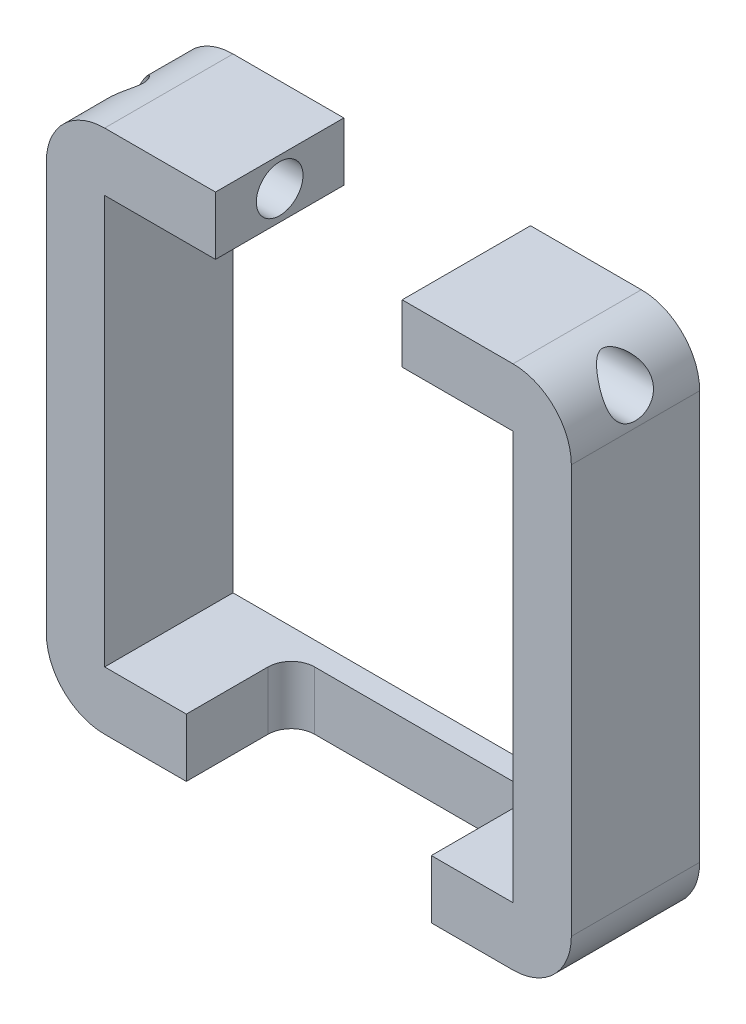
ISO-10303-21;
HEADER;
FILE_DESCRIPTION(('STEP AP214'),'2;1');
FILE_NAME('part.step','',(''),(''),'','','');
FILE_SCHEMA(('AUTOMOTIVE_DESIGN { 1 0 10303 214 1 1 1 1 }'));
ENDSEC;
DATA;
#1=APPLICATION_CONTEXT('core data for automotive mechanical design processes');
#2=APPLICATION_PROTOCOL_DEFINITION('international standard','automotive_design',2000,#1);
#3=PRODUCT_CONTEXT('',#1,'mechanical');
#4=PRODUCT('Part','Part','',(#3));
#5=PRODUCT_RELATED_PRODUCT_CATEGORY('part','',(#4));
#6=PRODUCT_DEFINITION_FORMATION('','',#4);
#7=PRODUCT_DEFINITION_CONTEXT('part definition',#1,'design');
#8=PRODUCT_DEFINITION('design','',#6,#7);
#9=PRODUCT_DEFINITION_SHAPE('','',#8);
#10=(LENGTH_UNIT() NAMED_UNIT(*) SI_UNIT(.MILLI.,.METRE.));
#11=(NAMED_UNIT(*) PLANE_ANGLE_UNIT() SI_UNIT($,.RADIAN.));
#12=(NAMED_UNIT(*) SI_UNIT($,.STERADIAN.) SOLID_ANGLE_UNIT());
#13=UNCERTAINTY_MEASURE_WITH_UNIT(LENGTH_MEASURE(1.E-05),#10,'distance_accuracy_value','');
#14=(GEOMETRIC_REPRESENTATION_CONTEXT(3) GLOBAL_UNCERTAINTY_ASSIGNED_CONTEXT((#13)) GLOBAL_UNIT_ASSIGNED_CONTEXT((#10,
#11,#12)) REPRESENTATION_CONTEXT('',''));
#15=CARTESIAN_POINT('',(0.,0.,0.));
#16=DIRECTION('',(0.,0.,1.));
#17=DIRECTION('',(1.,0.,0.));
#18=AXIS2_PLACEMENT_3D('',#15,#16,#17);
#19=CARTESIAN_POINT('',(-17.5,-17.5,11.));
#20=DIRECTION('',(0.,0.,-1.));
#21=DIRECTION('',(-1.,0.,0.));
#22=AXIS2_PLACEMENT_3D('',#19,#20,#21);
#23=PLANE('',#22);
#24=DIRECTION('',(0.,-1.,0.));
#25=VECTOR('',#24,1.);
#26=CARTESIAN_POINT('',(10.5,40.3473193175917,11.));
#27=LINE('',#26,#25);
#28=CARTESIAN_POINT('',(10.5,-17.5,11.));
#29=VERTEX_POINT('',#28);
#30=CARTESIAN_POINT('',(10.5,-22.5,11.));
#31=VERTEX_POINT('',#30);
#32=EDGE_CURVE('E454',#29,#31,#27,.T.);
#33=ORIENTED_EDGE('',*,*,#32,.T.);
#34=DIRECTION('',(1.,0.,0.));
#35=VECTOR('',#34,1.);
#36=CARTESIAN_POINT('',(17.5,-22.5,11.));
#37=LINE('',#36,#35);
#38=CARTESIAN_POINT('',(17.5,-22.5,11.));
#39=VERTEX_POINT('',#38);
#40=EDGE_CURVE('E256',#31,#39,#37,.T.);
#41=ORIENTED_EDGE('',*,*,#40,.T.);
#42=CARTESIAN_POINT('',(17.5,-17.5,11.));
#43=DIRECTION('',(0.,0.,1.));
#44=DIRECTION('',(1.,0.,0.));
#45=AXIS2_PLACEMENT_3D('',#42,#43,#44);
#46=CIRCLE('',#45,5.);
#47=CARTESIAN_POINT('',(22.5,-17.5,11.));
#48=VERTEX_POINT('',#47);
#49=EDGE_CURVE('E262',#39,#48,#46,.T.);
#50=ORIENTED_EDGE('',*,*,#49,.T.);
#51=DIRECTION('',(0.,1.,0.));
#52=VECTOR('',#51,1.);
#53=CARTESIAN_POINT('',(22.5,-17.5,11.));
#54=LINE('',#53,#52);
#55=CARTESIAN_POINT('',(22.5,17.5,11.));
#56=VERTEX_POINT('',#55);
#57=EDGE_CURVE('E265',#48,#56,#54,.T.);
#58=ORIENTED_EDGE('',*,*,#57,.T.);
#59=CARTESIAN_POINT('',(17.5,17.5,11.));
#60=DIRECTION('',(0.,0.,1.));
#61=DIRECTION('',(1.,0.,0.));
#62=AXIS2_PLACEMENT_3D('',#59,#60,#61);
#63=CIRCLE('',#62,5.);
#64=CARTESIAN_POINT('',(17.5,22.5,11.));
#65=VERTEX_POINT('',#64);
#66=EDGE_CURVE('E268',#56,#65,#63,.T.);
#67=ORIENTED_EDGE('',*,*,#66,.T.);
#68=DIRECTION('',(-1.,0.,0.));
#69=VECTOR('',#68,1.);
#70=CARTESIAN_POINT('',(17.5,22.5,11.));
#71=LINE('',#70,#69);
#72=CARTESIAN_POINT('',(8.,22.5,11.));
#73=VERTEX_POINT('',#72);
#74=EDGE_CURVE('E272',#65,#73,#71,.T.);
#75=ORIENTED_EDGE('',*,*,#74,.T.);
#76=DIRECTION('',(0.,1.,0.));
#77=VECTOR('',#76,1.);
#78=CARTESIAN_POINT('',(8.,25.5,11.));
#79=LINE('',#78,#77);
#80=CARTESIAN_POINT('',(8.,17.5,11.));
#81=VERTEX_POINT('',#80);
#82=EDGE_CURVE('E487',#81,#73,#79,.T.);
#83=ORIENTED_EDGE('',*,*,#82,.F.);
#84=DIRECTION('',(-1.,0.,0.));
#85=VECTOR('',#84,1.);
#86=CARTESIAN_POINT('',(17.5,17.5,11.));
#87=LINE('',#86,#85);
#88=CARTESIAN_POINT('',(17.5,17.5,11.));
#89=VERTEX_POINT('',#88);
#90=EDGE_CURVE('E213',#89,#81,#87,.T.);
#91=ORIENTED_EDGE('',*,*,#90,.F.);
#92=DIRECTION('',(0.,1.,0.));
#93=VECTOR('',#92,1.);
#94=CARTESIAN_POINT('',(17.5,-17.5,11.));
#95=LINE('',#94,#93);
#96=CARTESIAN_POINT('',(17.5,-17.5,11.));
#97=VERTEX_POINT('',#96);
#98=EDGE_CURVE('E235',#97,#89,#95,.T.);
#99=ORIENTED_EDGE('',*,*,#98,.F.);
#100=DIRECTION('',(1.,0.,0.));
#101=VECTOR('',#100,1.);
#102=CARTESIAN_POINT('',(17.5,-17.5,11.));
#103=LINE('',#102,#101);
#104=EDGE_CURVE('E458',#29,#97,#103,.T.);
#105=ORIENTED_EDGE('',*,*,#104,.F.);
#106=EDGE_LOOP('',(#33,#41,#50,#58,#67,#75,#83,#91,#99,#105));
#107=FACE_BOUND('',#106,.T.);
#108=ADVANCED_FACE('F38',(#107),#23,.F.);
#109=CARTESIAN_POINT('',(17.5,-22.5,11.));
#110=DIRECTION('',(0.,1.,0.));
#111=DIRECTION('',(-1.,0.,0.));
#112=AXIS2_PLACEMENT_3D('',#109,#110,#111);
#113=PLANE('',#112);
#114=DIRECTION('',(0.,0.,1.));
#115=VECTOR('',#114,1.);
#116=CARTESIAN_POINT('',(10.5,-22.5,11.));
#117=LINE('',#116,#115);
#118=CARTESIAN_POINT('',(10.5,-22.5,4.));
#119=VERTEX_POINT('',#118);
#120=EDGE_CURVE('E345',#119,#31,#117,.T.);
#121=ORIENTED_EDGE('',*,*,#120,.F.);
#122=CARTESIAN_POINT('',(8.50000000000001,-22.5,4.));
#123=DIRECTION('',(0.,-1.,0.));
#124=DIRECTION('',(1.,0.,0.));
#125=AXIS2_PLACEMENT_3D('',#122,#123,#124);
#126=CIRCLE('',#125,2.);
#127=CARTESIAN_POINT('',(8.50000000000001,-22.5,2.));
#128=VERTEX_POINT('',#127);
#129=EDGE_CURVE('E42',#119,#128,#126,.F.);
#130=ORIENTED_EDGE('',*,*,#129,.T.);
#131=DIRECTION('',(-1.,0.,0.));
#132=VECTOR('',#131,1.);
#133=CARTESIAN_POINT('',(0.,-22.5,2.));
#134=LINE('',#133,#132);
#135=CARTESIAN_POINT('',(-8.49999999999999,-22.5,2.));
#136=VERTEX_POINT('',#135);
#137=EDGE_CURVE('E359',#136,#128,#134,.F.);
#138=ORIENTED_EDGE('',*,*,#137,.F.);
#139=CARTESIAN_POINT('',(-8.49999999999999,-22.5,4.));
#140=DIRECTION('',(0.,-1.,0.));
#141=DIRECTION('',(1.,0.,0.));
#142=AXIS2_PLACEMENT_3D('',#139,#140,#141);
#143=CIRCLE('',#142,2.);
#144=CARTESIAN_POINT('',(-10.5,-22.5,4.));
#145=VERTEX_POINT('',#144);
#146=EDGE_CURVE('E357',#145,#136,#143,.T.);
#147=ORIENTED_EDGE('',*,*,#146,.F.);
#148=DIRECTION('',(0.,0.,1.));
#149=VECTOR('',#148,1.);
#150=CARTESIAN_POINT('',(-10.5,-22.5,11.));
#151=LINE('',#150,#149);
#152=CARTESIAN_POINT('',(-10.5,-22.5,11.));
#153=VERTEX_POINT('',#152);
#154=EDGE_CURVE('E360',#145,#153,#151,.T.);
#155=ORIENTED_EDGE('',*,*,#154,.T.);
#156=CARTESIAN_POINT('',(-17.5,-22.5,11.));
#157=VERTEX_POINT('',#156);
#158=EDGE_CURVE('E258',#157,#153,#37,.T.);
#159=ORIENTED_EDGE('',*,*,#158,.F.);
#160=DIRECTION('',(0.,0.,-1.));
#161=VECTOR('',#160,1.);
#162=CARTESIAN_POINT('',(-17.5,-22.5,11.));
#163=LINE('',#162,#161);
#164=CARTESIAN_POINT('',(-17.5,-22.5,0.));
#165=VERTEX_POINT('',#164);
#166=EDGE_CURVE('E334',#157,#165,#163,.T.);
#167=ORIENTED_EDGE('',*,*,#166,.T.);
#168=DIRECTION('',(1.,0.,0.));
#169=VECTOR('',#168,1.);
#170=CARTESIAN_POINT('',(17.5,-22.5,0.));
#171=LINE('',#170,#169);
#172=CARTESIAN_POINT('',(17.5,-22.5,0.));
#173=VERTEX_POINT('',#172);
#174=EDGE_CURVE('E286',#165,#173,#171,.T.);
#175=ORIENTED_EDGE('',*,*,#174,.T.);
#176=DIRECTION('',(0.,0.,-1.));
#177=VECTOR('',#176,1.);
#178=CARTESIAN_POINT('',(17.5,-22.5,11.));
#179=LINE('',#178,#177);
#180=EDGE_CURVE('E330',#39,#173,#179,.T.);
#181=ORIENTED_EDGE('',*,*,#180,.F.);
#182=ORIENTED_EDGE('',*,*,#40,.F.);
#183=EDGE_LOOP('',(#121,#130,#138,#147,#155,#159,#167,#175,#181,#182));
#184=FACE_BOUND('',#183,.T.);
#185=ADVANCED_FACE('F421',(#184),#113,.F.);
#186=CARTESIAN_POINT('',(17.5,-17.5,11.));
#187=DIRECTION('',(0.,1.,0.));
#188=DIRECTION('',(-1.,0.,0.));
#189=AXIS2_PLACEMENT_3D('',#186,#187,#188);
#190=PLANE('',#189);
#191=CARTESIAN_POINT('',(8.50000000000001,-17.5,4.));
#192=DIRECTION('',(0.,1.,0.));
#193=DIRECTION('',(-1.,0.,0.));
#194=AXIS2_PLACEMENT_3D('',#191,#192,#193);
#195=CIRCLE('',#194,2.);
#196=CARTESIAN_POINT('',(8.50000000000001,-17.5,2.));
#197=VERTEX_POINT('',#196);
#198=CARTESIAN_POINT('',(10.5,-17.5,4.));
#199=VERTEX_POINT('',#198);
#200=EDGE_CURVE('E49',#197,#199,#195,.F.);
#201=ORIENTED_EDGE('',*,*,#200,.T.);
#202=DIRECTION('',(0.,0.,1.));
#203=VECTOR('',#202,1.);
#204=CARTESIAN_POINT('',(10.5,-17.5,11.));
#205=LINE('',#204,#203);
#206=EDGE_CURVE('E11',#199,#29,#205,.T.);
#207=ORIENTED_EDGE('',*,*,#206,.T.);
#208=ORIENTED_EDGE('',*,*,#104,.T.);
#209=DIRECTION('',(0.,0.,-1.));
#210=VECTOR('',#209,1.);
#211=CARTESIAN_POINT('',(17.5,-17.5,11.));
#212=LINE('',#211,#210);
#213=CARTESIAN_POINT('',(17.5,-17.5,0.));
#214=VERTEX_POINT('',#213);
#215=EDGE_CURVE('E236',#97,#214,#212,.T.);
#216=ORIENTED_EDGE('',*,*,#215,.T.);
#217=DIRECTION('',(1.,0.,0.));
#218=VECTOR('',#217,1.);
#219=CARTESIAN_POINT('',(17.5,-17.5,0.));
#220=LINE('',#219,#218);
#221=CARTESIAN_POINT('',(-17.5,-17.5,0.));
#222=VERTEX_POINT('',#221);
#223=EDGE_CURVE('E228',#222,#214,#220,.T.);
#224=ORIENTED_EDGE('',*,*,#223,.F.);
#225=DIRECTION('',(0.,0.,-1.));
#226=VECTOR('',#225,1.);
#227=CARTESIAN_POINT('',(-17.5,-17.5,11.));
#228=LINE('',#227,#226);
#229=CARTESIAN_POINT('',(-17.5,-17.5,11.));
#230=VERTEX_POINT('',#229);
#231=EDGE_CURVE('E240',#230,#222,#228,.T.);
#232=ORIENTED_EDGE('',*,*,#231,.F.);
#233=CARTESIAN_POINT('',(-10.5,-17.5,11.));
#234=VERTEX_POINT('',#233);
#235=EDGE_CURVE('E241',#230,#234,#103,.T.);
#236=ORIENTED_EDGE('',*,*,#235,.T.);
#237=DIRECTION('',(0.,0.,1.));
#238=VECTOR('',#237,1.);
#239=CARTESIAN_POINT('',(-10.5,-17.5,11.));
#240=LINE('',#239,#238);
#241=CARTESIAN_POINT('',(-10.5,-17.5,4.));
#242=VERTEX_POINT('',#241);
#243=EDGE_CURVE('E84',#242,#234,#240,.T.);
#244=ORIENTED_EDGE('',*,*,#243,.F.);
#245=CARTESIAN_POINT('',(-8.49999999999999,-17.5,4.));
#246=DIRECTION('',(0.,1.,0.));
#247=DIRECTION('',(-1.,0.,0.));
#248=AXIS2_PLACEMENT_3D('',#245,#246,#247);
#249=CIRCLE('',#248,2.);
#250=CARTESIAN_POINT('',(-8.49999999999999,-17.5,2.));
#251=VERTEX_POINT('',#250);
#252=EDGE_CURVE('E348',#251,#242,#249,.T.);
#253=ORIENTED_EDGE('',*,*,#252,.F.);
#254=DIRECTION('',(-1.,0.,0.));
#255=VECTOR('',#254,1.);
#256=CARTESIAN_POINT('',(17.5,-17.5,2.));
#257=LINE('',#256,#255);
#258=EDGE_CURVE('E351',#197,#251,#257,.T.);
#259=ORIENTED_EDGE('',*,*,#258,.F.);
#260=EDGE_LOOP('',(#201,#207,#208,#216,#224,#232,#236,#244,#253,#259));
#261=FACE_BOUND('',#260,.T.);
#262=ADVANCED_FACE('F417',(#261),#190,.T.);
#263=CARTESIAN_POINT('',(17.5,22.5,11.));
#264=DIRECTION('',(0.,-1.,0.));
#265=DIRECTION('',(1.,0.,0.));
#266=AXIS2_PLACEMENT_3D('',#263,#264,#265);
#267=PLANE('',#266);
#268=DIRECTION('',(-1.,0.,0.));
#269=VECTOR('',#268,1.);
#270=CARTESIAN_POINT('',(17.5,22.5,0.));
#271=LINE('',#270,#269);
#272=CARTESIAN_POINT('',(17.5,22.5,0.));
#273=VERTEX_POINT('',#272);
#274=CARTESIAN_POINT('',(8.,22.5,0.));
#275=VERTEX_POINT('',#274);
#276=EDGE_CURVE('E299',#273,#275,#271,.T.);
#277=ORIENTED_EDGE('',*,*,#276,.T.);
#278=DIRECTION('',(0.,0.,1.));
#279=VECTOR('',#278,1.);
#280=CARTESIAN_POINT('',(8.,22.5,11.));
#281=LINE('',#280,#279);
#282=EDGE_CURVE('E198',#275,#73,#281,.T.);
#283=ORIENTED_EDGE('',*,*,#282,.T.);
#284=ORIENTED_EDGE('',*,*,#74,.F.);
#285=DIRECTION('',(0.,0.,-1.));
#286=VECTOR('',#285,1.);
#287=CARTESIAN_POINT('',(17.5,22.5,11.));
#288=LINE('',#287,#286);
#289=EDGE_CURVE('E318',#65,#273,#288,.T.);
#290=ORIENTED_EDGE('',*,*,#289,.T.);
#291=EDGE_LOOP('',(#277,#283,#284,#290));
#292=FACE_BOUND('',#291,.T.);
#293=ADVANCED_FACE('F420',(#292),#267,.F.);
#294=CARTESIAN_POINT('',(17.5,17.5,11.));
#295=DIRECTION('',(0.,-1.,0.));
#296=DIRECTION('',(1.,0.,0.));
#297=AXIS2_PLACEMENT_3D('',#294,#295,#296);
#298=PLANE('',#297);
#299=ORIENTED_EDGE('',*,*,#90,.T.);
#300=DIRECTION('',(0.,0.,1.));
#301=VECTOR('',#300,1.);
#302=CARTESIAN_POINT('',(8.,17.5,11.));
#303=LINE('',#302,#301);
#304=CARTESIAN_POINT('',(8.,17.5,0.));
#305=VERTEX_POINT('',#304);
#306=EDGE_CURVE('E195',#305,#81,#303,.T.);
#307=ORIENTED_EDGE('',*,*,#306,.F.);
#308=DIRECTION('',(-1.,0.,0.));
#309=VECTOR('',#308,1.);
#310=CARTESIAN_POINT('',(17.5,17.5,0.));
#311=LINE('',#310,#309);
#312=CARTESIAN_POINT('',(17.5,17.5,0.));
#313=VERTEX_POINT('',#312);
#314=EDGE_CURVE('E210',#313,#305,#311,.T.);
#315=ORIENTED_EDGE('',*,*,#314,.F.);
#316=DIRECTION('',(0.,0.,-1.));
#317=VECTOR('',#316,1.);
#318=CARTESIAN_POINT('',(17.5,17.5,11.));
#319=LINE('',#318,#317);
#320=EDGE_CURVE('E248',#89,#313,#319,.T.);
#321=ORIENTED_EDGE('',*,*,#320,.F.);
#322=EDGE_LOOP('',(#299,#307,#315,#321));
#323=FACE_BOUND('',#322,.T.);
#324=ADVANCED_FACE('F208',(#323),#298,.T.);
#325=ORIENTED_EDGE('',*,*,#158,.T.);
#326=DIRECTION('',(0.,-1.,0.));
#327=VECTOR('',#326,1.);
#328=CARTESIAN_POINT('',(-10.5,40.3473193175917,11.));
#329=LINE('',#328,#327);
#330=EDGE_CURVE('E534',#234,#153,#329,.T.);
#331=ORIENTED_EDGE('',*,*,#330,.F.);
#332=ORIENTED_EDGE('',*,*,#235,.F.);
#333=DIRECTION('',(0.,-1.,0.));
#334=VECTOR('',#333,1.);
#335=CARTESIAN_POINT('',(-17.5,-17.5,11.));
#336=LINE('',#335,#334);
#337=CARTESIAN_POINT('',(-17.5,17.5,11.));
#338=VERTEX_POINT('',#337);
#339=EDGE_CURVE('E468',#338,#230,#336,.T.);
#340=ORIENTED_EDGE('',*,*,#339,.F.);
#341=CARTESIAN_POINT('',(-8.,17.5,11.));
#342=VERTEX_POINT('',#341);
#343=EDGE_CURVE('E473',#342,#338,#87,.T.);
#344=ORIENTED_EDGE('',*,*,#343,.F.);
#345=DIRECTION('',(0.,-1.,0.));
#346=VECTOR('',#345,1.);
#347=CARTESIAN_POINT('',(-8.,25.5,11.));
#348=LINE('',#347,#346);
#349=CARTESIAN_POINT('',(-8.,22.5,11.));
#350=VERTEX_POINT('',#349);
#351=EDGE_CURVE('E205',#350,#342,#348,.T.);
#352=ORIENTED_EDGE('',*,*,#351,.F.);
#353=CARTESIAN_POINT('',(-17.5,22.5,11.));
#354=VERTEX_POINT('',#353);
#355=EDGE_CURVE('E271',#350,#354,#71,.T.);
#356=ORIENTED_EDGE('',*,*,#355,.T.);
#357=CARTESIAN_POINT('',(-17.5,17.5,11.));
#358=DIRECTION('',(0.,0.,1.));
#359=DIRECTION('',(1.,0.,0.));
#360=AXIS2_PLACEMENT_3D('',#357,#358,#359);
#361=CIRCLE('',#360,5.);
#362=CARTESIAN_POINT('',(-22.5,17.5,11.));
#363=VERTEX_POINT('',#362);
#364=EDGE_CURVE('E276',#354,#363,#361,.T.);
#365=ORIENTED_EDGE('',*,*,#364,.T.);
#366=DIRECTION('',(0.,-1.,0.));
#367=VECTOR('',#366,1.);
#368=CARTESIAN_POINT('',(-22.5,-17.5,11.));
#369=LINE('',#368,#367);
#370=CARTESIAN_POINT('',(-22.5,-17.5,11.));
#371=VERTEX_POINT('',#370);
#372=EDGE_CURVE('E279',#363,#371,#369,.T.);
#373=ORIENTED_EDGE('',*,*,#372,.T.);
#374=CARTESIAN_POINT('',(-17.5,-17.5,11.));
#375=DIRECTION('',(0.,0.,1.));
#376=DIRECTION('',(-1.,0.,0.));
#377=AXIS2_PLACEMENT_3D('',#374,#375,#376);
#378=CIRCLE('',#377,5.);
#379=EDGE_CURVE('E252',#371,#157,#378,.T.);
#380=ORIENTED_EDGE('',*,*,#379,.T.);
#381=EDGE_LOOP('',(#325,#331,#332,#340,#344,#352,#356,#365,#373,#380));
#382=FACE_BOUND('',#381,.T.);
#383=ADVANCED_FACE('F435',(#382),#23,.F.);
#384=CARTESIAN_POINT('',(-17.5,-17.5,0.));
#385=DIRECTION('',(0.,0.,-1.));
#386=DIRECTION('',(-1.,0.,0.));
#387=AXIS2_PLACEMENT_3D('',#384,#385,#386);
#388=PLANE('',#387);
#389=DIRECTION('',(0.,1.,0.));
#390=VECTOR('',#389,1.);
#391=CARTESIAN_POINT('',(8.,25.5,0.));
#392=LINE('',#391,#390);
#393=EDGE_CURVE('E192',#305,#275,#392,.T.);
#394=ORIENTED_EDGE('',*,*,#393,.T.);
#395=ORIENTED_EDGE('',*,*,#276,.F.);
#396=CARTESIAN_POINT('',(17.5,17.5,0.));
#397=DIRECTION('',(0.,0.,1.));
#398=DIRECTION('',(1.,0.,0.));
#399=AXIS2_PLACEMENT_3D('',#396,#397,#398);
#400=CIRCLE('',#399,5.);
#401=CARTESIAN_POINT('',(22.5,17.5,0.));
#402=VERTEX_POINT('',#401);
#403=EDGE_CURVE('E295',#402,#273,#400,.T.);
#404=ORIENTED_EDGE('',*,*,#403,.F.);
#405=DIRECTION('',(0.,1.,0.));
#406=VECTOR('',#405,1.);
#407=CARTESIAN_POINT('',(22.5,-17.5,0.));
#408=LINE('',#407,#406);
#409=CARTESIAN_POINT('',(22.5,-17.5,0.));
#410=VERTEX_POINT('',#409);
#411=EDGE_CURVE('E292',#410,#402,#408,.T.);
#412=ORIENTED_EDGE('',*,*,#411,.F.);
#413=CARTESIAN_POINT('',(17.5,-17.5,0.));
#414=DIRECTION('',(0.,0.,1.));
#415=DIRECTION('',(1.,0.,0.));
#416=AXIS2_PLACEMENT_3D('',#413,#414,#415);
#417=CIRCLE('',#416,5.);
#418=EDGE_CURVE('E289',#173,#410,#417,.T.);
#419=ORIENTED_EDGE('',*,*,#418,.F.);
#420=ORIENTED_EDGE('',*,*,#174,.F.);
#421=CARTESIAN_POINT('',(-17.5,-17.5,0.));
#422=DIRECTION('',(0.,0.,1.));
#423=DIRECTION('',(-1.,0.,0.));
#424=AXIS2_PLACEMENT_3D('',#421,#422,#423);
#425=CIRCLE('',#424,5.);
#426=CARTESIAN_POINT('',(-22.5,-17.5,0.));
#427=VERTEX_POINT('',#426);
#428=EDGE_CURVE('E251',#427,#165,#425,.T.);
#429=ORIENTED_EDGE('',*,*,#428,.F.);
#430=DIRECTION('',(0.,-1.,0.));
#431=VECTOR('',#430,1.);
#432=CARTESIAN_POINT('',(-22.5,-17.5,0.));
#433=LINE('',#432,#431);
#434=CARTESIAN_POINT('',(-22.5,17.5,0.));
#435=VERTEX_POINT('',#434);
#436=EDGE_CURVE('E257',#435,#427,#433,.T.);
#437=ORIENTED_EDGE('',*,*,#436,.F.);
#438=CARTESIAN_POINT('',(-17.5,17.5,0.));
#439=DIRECTION('',(0.,0.,1.));
#440=DIRECTION('',(1.,0.,0.));
#441=AXIS2_PLACEMENT_3D('',#438,#439,#440);
#442=CIRCLE('',#441,5.);
#443=CARTESIAN_POINT('',(-17.5,22.5,0.));
#444=VERTEX_POINT('',#443);
#445=EDGE_CURVE('E302',#444,#435,#442,.T.);
#446=ORIENTED_EDGE('',*,*,#445,.F.);
#447=CARTESIAN_POINT('',(-8.,22.5,0.));
#448=VERTEX_POINT('',#447);
#449=EDGE_CURVE('E298',#448,#444,#271,.T.);
#450=ORIENTED_EDGE('',*,*,#449,.F.);
#451=DIRECTION('',(0.,-1.,0.));
#452=VECTOR('',#451,1.);
#453=CARTESIAN_POINT('',(-8.,25.5,0.));
#454=LINE('',#453,#452);
#455=CARTESIAN_POINT('',(-8.,17.5,0.));
#456=VERTEX_POINT('',#455);
#457=EDGE_CURVE('E204',#448,#456,#454,.T.);
#458=ORIENTED_EDGE('',*,*,#457,.T.);
#459=CARTESIAN_POINT('',(-17.5,17.5,0.));
#460=VERTEX_POINT('',#459);
#461=EDGE_CURVE('E223',#456,#460,#311,.T.);
#462=ORIENTED_EDGE('',*,*,#461,.T.);
#463=DIRECTION('',(0.,-1.,0.));
#464=VECTOR('',#463,1.);
#465=CARTESIAN_POINT('',(-17.5,-17.5,0.));
#466=LINE('',#465,#464);
#467=EDGE_CURVE('E222',#460,#222,#466,.T.);
#468=ORIENTED_EDGE('',*,*,#467,.T.);
#469=ORIENTED_EDGE('',*,*,#223,.T.);
#470=DIRECTION('',(0.,1.,0.));
#471=VECTOR('',#470,1.);
#472=CARTESIAN_POINT('',(17.5,-17.5,0.));
#473=LINE('',#472,#471);
#474=EDGE_CURVE('E220',#214,#313,#473,.T.);
#475=ORIENTED_EDGE('',*,*,#474,.T.);
#476=ORIENTED_EDGE('',*,*,#314,.T.);
#477=EDGE_LOOP('',(#394,#395,#404,#412,#419,#420,#429,#437,#446,#450,#458,#462,#468,#469,#475,#476));
#478=FACE_BOUND('',#477,.T.);
#479=ADVANCED_FACE('F218',(#478),#388,.T.);
#480=CARTESIAN_POINT('',(-17.5,-17.5,11.));
#481=DIRECTION('',(0.,0.,-1.));
#482=DIRECTION('',(-1.,0.,0.));
#483=AXIS2_PLACEMENT_3D('',#480,#481,#482);
#484=CYLINDRICAL_SURFACE('',#483,5.);
#485=ORIENTED_EDGE('',*,*,#428,.T.);
#486=ORIENTED_EDGE('',*,*,#166,.F.);
#487=ORIENTED_EDGE('',*,*,#379,.F.);
#488=DIRECTION('',(0.,0.,-1.));
#489=VECTOR('',#488,1.);
#490=CARTESIAN_POINT('',(-22.5,-17.5,11.));
#491=LINE('',#490,#489);
#492=EDGE_CURVE('E282',#371,#427,#491,.T.);
#493=ORIENTED_EDGE('',*,*,#492,.T.);
#494=EDGE_LOOP('',(#485,#486,#487,#493));
#495=FACE_BOUND('',#494,.T.);
#496=ADVANCED_FACE('F40',(#495),#484,.T.);
#497=CARTESIAN_POINT('',(17.5,-17.5,11.));
#498=DIRECTION('',(0.,0.,-1.));
#499=DIRECTION('',(-1.,0.,0.));
#500=AXIS2_PLACEMENT_3D('',#497,#498,#499);
#501=CYLINDRICAL_SURFACE('',#500,5.);
#502=ORIENTED_EDGE('',*,*,#418,.T.);
#503=DIRECTION('',(0.,0.,-1.));
#504=VECTOR('',#503,1.);
#505=CARTESIAN_POINT('',(22.5,-17.5,11.));
#506=LINE('',#505,#504);
#507=EDGE_CURVE('E326',#48,#410,#506,.T.);
#508=ORIENTED_EDGE('',*,*,#507,.F.);
#509=ORIENTED_EDGE('',*,*,#49,.F.);
#510=ORIENTED_EDGE('',*,*,#180,.T.);
#511=EDGE_LOOP('',(#502,#508,#509,#510));
#512=FACE_BOUND('',#511,.T.);
#513=ADVANCED_FACE('F517',(#512),#501,.T.);
#514=CARTESIAN_POINT('',(22.5,-17.5,11.));
#515=DIRECTION('',(-1.,0.,0.));
#516=DIRECTION('',(0.,0.,1.));
#517=AXIS2_PLACEMENT_3D('',#514,#515,#516);
#518=PLANE('',#517);
#519=ORIENTED_EDGE('',*,*,#411,.T.);
#520=DIRECTION('',(0.,0.,-1.));
#521=VECTOR('',#520,1.);
#522=CARTESIAN_POINT('',(22.5,17.5,11.));
#523=LINE('',#522,#521);
#524=EDGE_CURVE('E322',#56,#402,#523,.T.);
#525=ORIENTED_EDGE('',*,*,#524,.F.);
#526=ORIENTED_EDGE('',*,*,#57,.F.);
#527=ORIENTED_EDGE('',*,*,#507,.T.);
#528=EDGE_LOOP('',(#519,#525,#526,#527));
#529=FACE_BOUND('',#528,.T.);
#530=ADVANCED_FACE('F514',(#529),#518,.F.);
#531=CARTESIAN_POINT('',(17.5,17.5,11.));
#532=DIRECTION('',(0.,0.,-1.));
#533=DIRECTION('',(-1.,0.,0.));
#534=AXIS2_PLACEMENT_3D('',#531,#532,#533);
#535=CYLINDRICAL_SURFACE('',#534,5.);
#536=CARTESIAN_POINT('',(19.6794494717703,22.,5.5));
#537=CARTESIAN_POINT('',(19.6794610871701,21.9999956682622,5.44387350314343));
#538=CARTESIAN_POINT('',(19.6844150857633,21.9976052421311,5.3876670854986));
#539=CARTESIAN_POINT('',(19.703410387151,21.9883275174123,5.27716105357668));
#540=CARTESIAN_POINT('',(19.7174774225732,21.9814274844861,5.2228672992719));
#541=CARTESIAN_POINT('',(19.758857089708,21.9607461476106,5.09918814779269));
#542=CARTESIAN_POINT('',(19.7890647844713,21.9454122845089,5.03105630793691));
#543=CARTESIAN_POINT('',(19.8578472870379,21.9093157288409,4.90073392641085));
#544=CARTESIAN_POINT('',(19.8964457573905,21.8885376484833,4.83856091845565));
#545=CARTESIAN_POINT('',(19.9755594938146,21.8443643412487,4.72426502238298));
#546=CARTESIAN_POINT('',(20.0156861228987,21.8213028323326,4.67173631416122));
#547=CARTESIAN_POINT('',(20.0987916426582,21.7718407837752,4.57061782630151));
#548=CARTESIAN_POINT('',(20.1417728785505,21.7454374821284,4.52203136008637));
#549=CARTESIAN_POINT('',(20.2296085749584,21.6895053926106,4.4282936774126));
#550=CARTESIAN_POINT('',(20.2744665939904,21.6599704877905,4.38314949166027));
#551=CARTESIAN_POINT('',(20.3652752249796,21.5979537199052,4.29608988757497));
#552=CARTESIAN_POINT('',(20.4112261157368,21.5654710987729,4.2541753049559));
#553=CARTESIAN_POINT('',(20.5226655839025,21.4837200999407,4.15682808001239));
#554=CARTESIAN_POINT('',(20.5884369257356,21.4330317056113,4.1029027157887));
#555=CARTESIAN_POINT('',(20.7200401680996,21.3260350404006,4.00097044067647));
#556=CARTESIAN_POINT('',(20.7858720824527,21.2697244287569,3.95296601366951));
#557=CARTESIAN_POINT('',(20.9166361229946,21.1516220653819,3.86315566336801));
#558=CARTESIAN_POINT('',(20.9815694818802,21.0898389137179,3.82134028087125));
#559=CARTESIAN_POINT('',(21.1098739518841,20.9607943930903,3.74428888265097));
#560=CARTESIAN_POINT('',(21.1732449935161,20.8935327810349,3.70905315911077));
#561=CARTESIAN_POINT('',(21.3297055004064,20.7176715290623,3.62958388183047));
#562=CARTESIAN_POINT('',(21.4213459075965,20.6055802303112,3.59002070786181));
#563=CARTESIAN_POINT('',(21.5965802317542,20.3704435840845,3.5308843394572));
#564=CARTESIAN_POINT('',(21.6801863967492,20.2474154790547,3.51128026549913));
#565=CARTESIAN_POINT('',(21.8227256004434,20.0157757317008,3.49732350273812));
#566=CARTESIAN_POINT('',(21.8834037392977,19.9084828574563,3.49910538392452));
#567=CARTESIAN_POINT('',(21.9959888320893,19.6911244728663,3.52098434840557));
#568=CARTESIAN_POINT('',(22.0478995516625,19.5810601763164,3.54107354481355));
#569=CARTESIAN_POINT('',(22.1421500583991,19.3613995422978,3.60125761666443));
#570=CARTESIAN_POINT('',(22.1844315501177,19.251809800584,3.64146986499998));
#571=CARTESIAN_POINT('',(22.2587087632043,19.0386462497835,3.74225311298602));
#572=CARTESIAN_POINT('',(22.2907082648158,18.9350702412083,3.80281661356793));
#573=CARTESIAN_POINT('',(22.3423354917758,18.7490625781852,3.93575586963214));
#574=CARTESIAN_POINT('',(22.3628988545083,18.6655519228036,4.00626896484892));
#575=CARTESIAN_POINT('',(22.3974620935554,18.510534972916,4.16079708237234));
#576=CARTESIAN_POINT('',(22.4114626838356,18.4390273731381,4.24481063462502));
#577=CARTESIAN_POINT('',(22.434040674918,18.3119908791552,4.4219248748285));
#578=CARTESIAN_POINT('',(22.4427311921811,18.2561435084575,4.51478343219729));
#579=CARTESIAN_POINT('',(22.4564738753053,18.1600976593587,4.70851382594113));
#580=CARTESIAN_POINT('',(22.4615258385263,18.1199000525889,4.80938610827306));
#581=CARTESIAN_POINT('',(22.4691310823275,18.055707830683,5.01842387096183));
#582=CARTESIAN_POINT('',(22.471633407765,18.032046501529,5.12669359665549));
#583=CARTESIAN_POINT('',(22.4746662323596,18.0029044548575,5.34568335407257));
#584=CARTESIAN_POINT('',(22.4751965690477,17.9974252353384,5.45640358693332));
#585=CARTESIAN_POINT('',(22.4744488548188,18.0048501580201,5.67850212807621));
#586=CARTESIAN_POINT('',(22.4731499137831,18.0179666726707,5.78987333705495));
#587=CARTESIAN_POINT('',(22.4682991322877,18.0625845184449,6.0088262526139));
#588=CARTESIAN_POINT('',(22.4647472065699,18.094086545315,6.11640781562252));
#589=CARTESIAN_POINT('',(22.4544605578853,18.1745021737181,6.32462301660822));
#590=CARTESIAN_POINT('',(22.4477278206003,18.2234049078362,6.42526094442365));
#591=CARTESIAN_POINT('',(22.4297687860654,18.3370632295024,6.61670393457601));
#592=CARTESIAN_POINT('',(22.4185430778429,18.4018167385859,6.7075102838485));
#593=CARTESIAN_POINT('',(22.3903311008057,18.5439450237596,6.8754398079596));
#594=CARTESIAN_POINT('',(22.3734267079842,18.6211327192152,6.95273496363904));
#595=CARTESIAN_POINT('',(22.3325576045208,18.7859128915829,7.09301412952065));
#596=CARTESIAN_POINT('',(22.3085946551913,18.8735027696019,7.15600170293876));
#597=CARTESIAN_POINT('',(22.2532642330155,19.0540999904482,7.26528068506956));
#598=CARTESIAN_POINT('',(22.2220374294027,19.1469818296547,7.31185156000499));
#599=CARTESIAN_POINT('',(22.1517301340278,19.3361893799151,7.38939558491485));
#600=CARTESIAN_POINT('',(22.1126488415162,19.4325154412768,7.42036714344058));
#601=CARTESIAN_POINT('',(22.0257097692534,19.6283233268988,7.46781818434744));
#602=CARTESIAN_POINT('',(21.9776263091685,19.7278141103564,7.48384121714327));
#603=CARTESIAN_POINT('',(21.8743601636508,19.9243182504917,7.50100358811658));
#604=CARTESIAN_POINT('',(21.81917486321,20.0213306787511,7.50213742793624));
#605=CARTESIAN_POINT('',(21.6956091506305,20.2225837891963,7.49043617758354));
#606=CARTESIAN_POINT('',(21.6264409097284,20.3262349557607,7.47585646389394));
#607=CARTESIAN_POINT('',(21.4822215681467,20.5260802189683,7.43228361434451));
#608=CARTESIAN_POINT('',(21.407166389842,20.6222690533926,7.40328041236248));
#609=CARTESIAN_POINT('',(21.2143781318608,20.8519514421749,7.3154656053545));
#610=CARTESIAN_POINT('',(21.0939257593817,20.9803131032096,7.24900480863655));
#611=CARTESIAN_POINT('',(20.9098516731842,21.1579063109286,7.13226620356138));
#612=CARTESIAN_POINT('',(20.8478098254164,21.2147036092391,7.09041883073679));
#613=CARTESIAN_POINT('',(20.7232372828736,21.3232894868493,7.00127828356791));
#614=CARTESIAN_POINT('',(20.6607067356712,21.3750795194864,6.95398669816593));
#615=CARTESIAN_POINT('',(20.545816061733,21.465789703292,6.86196517443614));
#616=CARTESIAN_POINT('',(20.4934117857071,21.5054497651041,6.81801336044393));
#617=CARTESIAN_POINT('',(20.3893922217056,21.5811203987927,6.72621238159748));
#618=CARTESIAN_POINT('',(20.3377767890549,21.6171316468565,6.67836394182969));
#619=CARTESIAN_POINT('',(20.236265454929,21.6852808402617,6.57864110605409));
#620=CARTESIAN_POINT('',(20.1863646909691,21.7174305197405,6.52677973678277));
#621=CARTESIAN_POINT('',(20.0892744922947,21.7777228764064,6.41844588934647));
#622=CARTESIAN_POINT('',(20.0420825345094,21.8058693196845,6.36197782475972));
#623=CARTESIAN_POINT('',(19.9566009553914,21.8551461997104,6.2495451203254));
#624=CARTESIAN_POINT('',(19.9178926918383,21.8766958604517,6.19408783665427));
#625=CARTESIAN_POINT('',(19.8461279533412,21.9155795731742,6.07817276787235));
#626=CARTESIAN_POINT('',(19.8130672138284,21.9329168102642,6.01771880750839));
#627=CARTESIAN_POINT('',(19.7615302187217,21.9593887327359,5.90430649155941));
#628=CARTESIAN_POINT('',(19.7414561524271,21.9694736479165,5.8523114023411));
#629=CARTESIAN_POINT('',(19.708982785266,21.9856139119574,5.7454197611802));
#630=CARTESIAN_POINT('',(19.6965591999848,21.9916820157608,5.69053299666233));
#631=CARTESIAN_POINT('',(19.6857273702052,21.9969551326303,5.61258022016376));
#632=CARTESIAN_POINT('',(19.6833815870709,21.9980938692664,5.59014917773607));
#633=CARTESIAN_POINT('',(19.6802401440762,21.9996172508021,5.54514975371859));
#634=CARTESIAN_POINT('',(19.6794447985524,22.0000017427859,5.52258134520928));
#635=CARTESIAN_POINT('',(19.6794494717703,22.,5.5));
#636=B_SPLINE_CURVE_WITH_KNOTS('',3,(#536,#537,#538,#539,#540,#541,#542,#543,#544,#545,#546,
#547,#548,#549,#550,#551,#552,#553,#554,#555,#556,#557,#558,#559,#560,#561,#562,#563,#564,#565,
#566,#567,#568,#569,#570,#571,#572,#573,#574,#575,#576,#577,#578,#579,#580,#581,#582,#583,#584,
#585,#586,#587,#588,#589,#590,#591,#592,#593,#594,#595,#596,#597,#598,#599,#600,#601,#602,#603,
#604,#605,#606,#607,#608,#609,#610,#611,#612,#613,#614,#615,#616,#617,#618,#619,#620,#621,#622,
#623,#624,#625,#626,#627,#628,#629,#630,#631,#632,#633,#634,#635),.UNSPECIFIED.,.T.,.F.,(4,2,2,
2,2,2,2,2,2,2,2,2,2,2,2,2,2,2,2,2,2,2,2,2,2,2,2,2,2,2,2,2,2,2,2,2,2,2,2,2,2,2,2,2,2,2,2,2,2,4),
(0.,0.168276566456788,0.337030381556528,0.563988116254191,0.791594387632326,1.00132457747204,
1.21122925619399,1.42155176971322,1.63192852619309,1.92859849313768,2.22539249529196,
2.52172809288754,2.81807684674827,3.2665977506196,3.71442367049159,4.08273698538509,
4.45089170395698,4.82121925592455,5.19141049824762,5.5234190235881,5.85539142125285,
6.18002018035632,6.5046670174413,6.83568177198468,7.16672379768758,7.50157708412907,
7.83644304294942,8.17110023104465,8.50571356003168,8.83569586261439,9.16559589479886,
9.48957273996175,9.81358263068478,10.1471901223618,10.4809208068675,10.8559179856662,
11.2311772422567,11.7923779480096,12.0740219398136,12.3555839386989,12.5926073921329,
12.8295868404413,13.0658269141225,13.3018432509781,13.5144111936696,13.7268179052204,
13.8961855613547,14.0650127957769,14.1327017001362,14.2004043263575),.UNSPECIFIED.);
#637=CARTESIAN_POINT('',(19.6794494717703,22.,5.5));
#638=VERTEX_POINT('',#637);
#639=EDGE_CURVE('E390',#638,#638,#636,.T.);
#640=ORIENTED_EDGE('',*,*,#639,.T.);
#641=EDGE_LOOP('',(#640));
#642=FACE_BOUND('',#641,.T.);
#643=ORIENTED_EDGE('',*,*,#403,.T.);
#644=ORIENTED_EDGE('',*,*,#289,.F.);
#645=ORIENTED_EDGE('',*,*,#66,.F.);
#646=ORIENTED_EDGE('',*,*,#524,.T.);
#647=EDGE_LOOP('',(#643,#644,#645,#646));
#648=FACE_BOUND('',#647,.T.);
#649=ADVANCED_FACE('F509',(#642,#648),#535,.T.);
#650=ORIENTED_EDGE('',*,*,#355,.F.);
#651=DIRECTION('',(0.,0.,-1.));
#652=VECTOR('',#651,1.);
#653=CARTESIAN_POINT('',(-8.,22.5,11.));
#654=LINE('',#653,#652);
#655=EDGE_CURVE('E481',#350,#448,#654,.T.);
#656=ORIENTED_EDGE('',*,*,#655,.T.);
#657=ORIENTED_EDGE('',*,*,#449,.T.);
#658=DIRECTION('',(0.,0.,-1.));
#659=VECTOR('',#658,1.);
#660=CARTESIAN_POINT('',(-17.5,22.5,11.));
#661=LINE('',#660,#659);
#662=EDGE_CURVE('E314',#354,#444,#661,.T.);
#663=ORIENTED_EDGE('',*,*,#662,.F.);
#664=EDGE_LOOP('',(#650,#656,#657,#663));
#665=FACE_BOUND('',#664,.T.);
#666=ADVANCED_FACE('F445',(#665),#267,.F.);
#667=CARTESIAN_POINT('',(-17.5,17.5,11.));
#668=DIRECTION('',(0.,0.,-1.));
#669=DIRECTION('',(-1.,0.,0.));
#670=AXIS2_PLACEMENT_3D('',#667,#668,#669);
#671=CYLINDRICAL_SURFACE('',#670,5.);
#672=CARTESIAN_POINT('',(-19.6794494717703,22.,5.5));
#673=CARTESIAN_POINT('',(-19.6794610871701,21.9999956682622,5.55612649685657));
#674=CARTESIAN_POINT('',(-19.6844150857633,21.9976052421311,5.6123329145014));
#675=CARTESIAN_POINT('',(-19.703410387151,21.9883275174123,5.72283894642332));
#676=CARTESIAN_POINT('',(-19.7174774225732,21.9814274844861,5.7771327007281));
#677=CARTESIAN_POINT('',(-19.758857089708,21.9607461476105,5.90081185220731));
#678=CARTESIAN_POINT('',(-19.7890647844713,21.9454122845089,5.96894369206309));
#679=CARTESIAN_POINT('',(-19.8578472870379,21.9093157288409,6.09926607358915));
#680=CARTESIAN_POINT('',(-19.8964457573904,21.8885376484833,6.16143908154435));
#681=CARTESIAN_POINT('',(-19.9755594938146,21.8443643412486,6.27573497761702));
#682=CARTESIAN_POINT('',(-20.0156861228987,21.8213028323326,6.32826368583878));
#683=CARTESIAN_POINT('',(-20.0987916426582,21.7718407837752,6.4293821736985));
#684=CARTESIAN_POINT('',(-20.1417728785505,21.7454374821284,6.47796863991363));
#685=CARTESIAN_POINT('',(-20.2296085749584,21.6895053926106,6.5717063225874));
#686=CARTESIAN_POINT('',(-20.2744665939904,21.6599704877905,6.61685050833973));
#687=CARTESIAN_POINT('',(-20.3652752249796,21.5979537199052,6.70391011242503));
#688=CARTESIAN_POINT('',(-20.4112261157368,21.5654710987729,6.7458246950441));
#689=CARTESIAN_POINT('',(-20.5226655839025,21.4837200999407,6.84317191998761));
#690=CARTESIAN_POINT('',(-20.5884369257356,21.4330317056112,6.8970972842113));
#691=CARTESIAN_POINT('',(-20.7200401680996,21.3260350404006,6.99902955932353));
#692=CARTESIAN_POINT('',(-20.7858720824526,21.2697244287569,7.04703398633048));
#693=CARTESIAN_POINT('',(-20.9166361229946,21.1516220653819,7.13684433663199));
#694=CARTESIAN_POINT('',(-20.9815694818802,21.0898389137179,7.17865971912875));
#695=CARTESIAN_POINT('',(-21.1098739518841,20.9607943930903,7.25571111734903));
#696=CARTESIAN_POINT('',(-21.1732449935161,20.8935327810349,7.29094684088923));
#697=CARTESIAN_POINT('',(-21.3297055004063,20.7176715290623,7.37041611816953));
#698=CARTESIAN_POINT('',(-21.4213459075965,20.6055802303112,7.40997929213819));
#699=CARTESIAN_POINT('',(-21.5965802317542,20.3704435840845,7.4691156605428));
#700=CARTESIAN_POINT('',(-21.6801863967491,20.2474154790547,7.48871973450087));
#701=CARTESIAN_POINT('',(-21.8227256004434,20.0157757317008,7.50267649726188));
#702=CARTESIAN_POINT('',(-21.8834037392976,19.9084828574563,7.50089461607548));
#703=CARTESIAN_POINT('',(-21.9959888320893,19.6911244728663,7.47901565159443));
#704=CARTESIAN_POINT('',(-22.0478995516625,19.5810601763164,7.45892645518645));
#705=CARTESIAN_POINT('',(-22.1421500583991,19.3613995422978,7.39874238333557));
#706=CARTESIAN_POINT('',(-22.1844315501177,19.251809800584,7.35853013500002));
#707=CARTESIAN_POINT('',(-22.2587087632043,19.0386462497835,7.25774688701398));
#708=CARTESIAN_POINT('',(-22.2907082648158,18.9350702412083,7.19718338643206));
#709=CARTESIAN_POINT('',(-22.3423354917758,18.7490625781852,7.06424413036786));
#710=CARTESIAN_POINT('',(-22.3628988545083,18.6655519228036,6.99373103515107));
#711=CARTESIAN_POINT('',(-22.3974620935554,18.510534972916,6.83920291762765));
#712=CARTESIAN_POINT('',(-22.4114626838356,18.4390273731381,6.75518936537498));
#713=CARTESIAN_POINT('',(-22.4340406749179,18.3119908791552,6.5780751251715));
#714=CARTESIAN_POINT('',(-22.4427311921811,18.2561435084575,6.48521656780271));
#715=CARTESIAN_POINT('',(-22.4564738753053,18.1600976593587,6.29148617405886));
#716=CARTESIAN_POINT('',(-22.4615258385263,18.1199000525889,6.19061389172693));
#717=CARTESIAN_POINT('',(-22.4691310823274,18.055707830683,5.98157612903816));
#718=CARTESIAN_POINT('',(-22.471633407765,18.032046501529,5.8733064033445));
#719=CARTESIAN_POINT('',(-22.4746662323596,18.0029044548575,5.65431664592742));
#720=CARTESIAN_POINT('',(-22.4751965690477,17.9974252353384,5.54359641306667));
#721=CARTESIAN_POINT('',(-22.4744488548188,18.00485015802,5.32149787192378));
#722=CARTESIAN_POINT('',(-22.4731499137831,18.0179666726707,5.21012666294504));
#723=CARTESIAN_POINT('',(-22.4682991322877,18.0625845184449,4.99117374738609));
#724=CARTESIAN_POINT('',(-22.4647472065699,18.094086545315,4.88359218437748));
#725=CARTESIAN_POINT('',(-22.4544605578853,18.1745021737181,4.67537698339178));
#726=CARTESIAN_POINT('',(-22.4477278206003,18.2234049078362,4.57473905557634));
#727=CARTESIAN_POINT('',(-22.4297687860654,18.3370632295024,4.38329606542399));
#728=CARTESIAN_POINT('',(-22.4185430778429,18.4018167385859,4.29248971615149));
#729=CARTESIAN_POINT('',(-22.3903311008057,18.5439450237596,4.12456019204039));
#730=CARTESIAN_POINT('',(-22.3734267079841,18.6211327192152,4.04726503636095));
#731=CARTESIAN_POINT('',(-22.3325576045208,18.7859128915829,3.90698587047934));
#732=CARTESIAN_POINT('',(-22.3085946551913,18.8735027696019,3.84399829706123));
#733=CARTESIAN_POINT('',(-22.2532642330155,19.0540999904482,3.73471931493044));
#734=CARTESIAN_POINT('',(-22.2220374294027,19.1469818296547,3.68814843999501));
#735=CARTESIAN_POINT('',(-22.1517301340278,19.3361893799151,3.61060441508515));
#736=CARTESIAN_POINT('',(-22.1126488415162,19.4325154412768,3.57963285655942));
#737=CARTESIAN_POINT('',(-22.0257097692534,19.6283233268988,3.53218181565256));
#738=CARTESIAN_POINT('',(-21.9776263091685,19.7278141103564,3.51615878285673));
#739=CARTESIAN_POINT('',(-21.8743601636508,19.9243182504917,3.49899641188342));
#740=CARTESIAN_POINT('',(-21.81917486321,20.0213306787511,3.49786257206376));
#741=CARTESIAN_POINT('',(-21.6956091506305,20.2225837891963,3.50956382241646));
#742=CARTESIAN_POINT('',(-21.6264409097283,20.3262349557607,3.52414353610606));
#743=CARTESIAN_POINT('',(-21.4822215681467,20.5260802189683,3.56771638565549));
#744=CARTESIAN_POINT('',(-21.4071663898419,20.6222690533926,3.59671958763752));
#745=CARTESIAN_POINT('',(-21.2143781318607,20.8519514421749,3.6845343946455));
#746=CARTESIAN_POINT('',(-21.0939257593817,20.9803131032096,3.75099519136345));
#747=CARTESIAN_POINT('',(-20.9098516731841,21.1579063109286,3.86773379643863));
#748=CARTESIAN_POINT('',(-20.8478098254163,21.2147036092391,3.90958116926322));
#749=CARTESIAN_POINT('',(-20.7232372828736,21.3232894868493,3.9987217164321));
#750=CARTESIAN_POINT('',(-20.6607067356712,21.3750795194864,4.04601330183408));
#751=CARTESIAN_POINT('',(-20.545816061733,21.465789703292,4.13803482556387));
#752=CARTESIAN_POINT('',(-20.4934117857071,21.5054497651041,4.18198663955607));
#753=CARTESIAN_POINT('',(-20.3893922217056,21.5811203987927,4.27378761840252));
#754=CARTESIAN_POINT('',(-20.3377767890549,21.6171316468565,4.32163605817031));
#755=CARTESIAN_POINT('',(-20.236265454929,21.6852808402617,4.42135889394591));
#756=CARTESIAN_POINT('',(-20.1863646909691,21.7174305197405,4.47322026321722));
#757=CARTESIAN_POINT('',(-20.0892744922947,21.7777228764064,4.58155411065352));
#758=CARTESIAN_POINT('',(-20.0420825345094,21.8058693196845,4.63802217524027));
#759=CARTESIAN_POINT('',(-19.9566009553914,21.8551461997104,4.75045487967459));
#760=CARTESIAN_POINT('',(-19.9178926918383,21.8766958604517,4.80591216334572));
#761=CARTESIAN_POINT('',(-19.8461279533411,21.9155795731742,4.92182723212765));
#762=CARTESIAN_POINT('',(-19.8130672138284,21.9329168102642,4.98228119249161));
#763=CARTESIAN_POINT('',(-19.7615302187217,21.9593887327359,5.09569350844058));
#764=CARTESIAN_POINT('',(-19.7414561524271,21.9694736479165,5.1476885976589));
#765=CARTESIAN_POINT('',(-19.7089827852659,21.9856139119574,5.2545802388198));
#766=CARTESIAN_POINT('',(-19.6965591999848,21.9916820157608,5.30946700333767));
#767=CARTESIAN_POINT('',(-19.6857273702052,21.9969551326303,5.38741977983624));
#768=CARTESIAN_POINT('',(-19.6833815870709,21.9980938692664,5.40985082226393));
#769=CARTESIAN_POINT('',(-19.6802401440762,21.9996172508021,5.45485024628141));
#770=CARTESIAN_POINT('',(-19.6794447985524,22.0000017427859,5.47741865479072));
#771=CARTESIAN_POINT('',(-19.6794494717703,22.,5.5));
#772=B_SPLINE_CURVE_WITH_KNOTS('',3,(#672,#673,#674,#675,#676,#677,#678,#679,#680,#681,#682,
#683,#684,#685,#686,#687,#688,#689,#690,#691,#692,#693,#694,#695,#696,#697,#698,#699,#700,#701,
#702,#703,#704,#705,#706,#707,#708,#709,#710,#711,#712,#713,#714,#715,#716,#717,#718,#719,#720,
#721,#722,#723,#724,#725,#726,#727,#728,#729,#730,#731,#732,#733,#734,#735,#736,#737,#738,#739,
#740,#741,#742,#743,#744,#745,#746,#747,#748,#749,#750,#751,#752,#753,#754,#755,#756,#757,#758,
#759,#760,#761,#762,#763,#764,#765,#766,#767,#768,#769,#770,#771),.UNSPECIFIED.,.T.,.F.,(4,2,2,
2,2,2,2,2,2,2,2,2,2,2,2,2,2,2,2,2,2,2,2,2,2,2,2,2,2,2,2,2,2,2,2,2,2,2,2,2,2,2,2,2,2,2,2,2,2,4),
(0.,0.168276566456791,0.337030381556529,0.563988116254192,0.791594387632327,1.00132457747204,
1.21122925619399,1.42155176971322,1.63192852619309,1.92859849313767,2.22539249529196,
2.52172809288754,2.81807684674827,3.26659775061959,3.71442367049158,4.08273698538509,
4.45089170395697,4.82121925592455,5.19141049824762,5.5234190235881,5.85539142125285,
6.18002018035632,6.50466701744131,6.83568177198468,7.16672379768758,7.50157708412908,
7.83644304294943,8.17110023104465,8.50571356003169,8.83569586261439,9.16559589479887,
9.48957273996176,9.81358263068479,10.1471901223618,10.4809208068675,10.8559179856662,
11.2311772422567,11.7923779480097,12.0740219398136,12.3555839386989,12.5926073921329,
12.8295868404413,13.0658269141225,13.3018432509781,13.5144111936696,13.7268179052204,
13.8961855613547,14.0650127957769,14.1327017001362,14.2004043263575),.UNSPECIFIED.);
#773=CARTESIAN_POINT('',(-19.6794494717703,22.,5.5));
#774=VERTEX_POINT('',#773);
#775=EDGE_CURVE('E381',#774,#774,#772,.T.);
#776=ORIENTED_EDGE('',*,*,#775,.T.);
#777=EDGE_LOOP('',(#776));
#778=FACE_BOUND('',#777,.T.);
#779=ORIENTED_EDGE('',*,*,#445,.T.);
#780=DIRECTION('',(0.,0.,-1.));
#781=VECTOR('',#780,1.);
#782=CARTESIAN_POINT('',(-22.5,17.5,11.));
#783=LINE('',#782,#781);
#784=EDGE_CURVE('E310',#363,#435,#783,.T.);
#785=ORIENTED_EDGE('',*,*,#784,.F.);
#786=ORIENTED_EDGE('',*,*,#364,.F.);
#787=ORIENTED_EDGE('',*,*,#662,.T.);
#788=EDGE_LOOP('',(#779,#785,#786,#787));
#789=FACE_BOUND('',#788,.T.);
#790=ADVANCED_FACE('F395',(#778,#789),#671,.T.);
#791=CARTESIAN_POINT('',(-22.5,-17.5,11.));
#792=DIRECTION('',(1.,0.,0.));
#793=DIRECTION('',(0.,0.,-1.));
#794=AXIS2_PLACEMENT_3D('',#791,#792,#793);
#795=PLANE('',#794);
#796=ORIENTED_EDGE('',*,*,#436,.T.);
#797=ORIENTED_EDGE('',*,*,#492,.F.);
#798=ORIENTED_EDGE('',*,*,#372,.F.);
#799=ORIENTED_EDGE('',*,*,#784,.T.);
#800=EDGE_LOOP('',(#796,#797,#798,#799));
#801=FACE_BOUND('',#800,.T.);
#802=ADVANCED_FACE('F433',(#801),#795,.F.);
#803=CARTESIAN_POINT('',(17.5,-17.5,11.));
#804=DIRECTION('',(-1.,0.,0.));
#805=DIRECTION('',(0.,0.,1.));
#806=AXIS2_PLACEMENT_3D('',#803,#804,#805);
#807=PLANE('',#806);
#808=ORIENTED_EDGE('',*,*,#474,.F.);
#809=ORIENTED_EDGE('',*,*,#215,.F.);
#810=ORIENTED_EDGE('',*,*,#98,.T.);
#811=ORIENTED_EDGE('',*,*,#320,.T.);
#812=EDGE_LOOP('',(#808,#809,#810,#811));
#813=FACE_BOUND('',#812,.T.);
#814=ADVANCED_FACE('F429',(#813),#807,.T.);
#815=ORIENTED_EDGE('',*,*,#461,.F.);
#816=DIRECTION('',(0.,0.,-1.));
#817=VECTOR('',#816,1.);
#818=CARTESIAN_POINT('',(-8.,17.5,11.));
#819=LINE('',#818,#817);
#820=EDGE_CURVE('E215',#342,#456,#819,.T.);
#821=ORIENTED_EDGE('',*,*,#820,.F.);
#822=ORIENTED_EDGE('',*,*,#343,.T.);
#823=DIRECTION('',(0.,0.,-1.));
#824=VECTOR('',#823,1.);
#825=CARTESIAN_POINT('',(-17.5,17.5,11.));
#826=LINE('',#825,#824);
#827=EDGE_CURVE('E244',#338,#460,#826,.T.);
#828=ORIENTED_EDGE('',*,*,#827,.T.);
#829=EDGE_LOOP('',(#815,#821,#822,#828));
#830=FACE_BOUND('',#829,.T.);
#831=ADVANCED_FACE('F425',(#830),#298,.T.);
#832=CARTESIAN_POINT('',(-17.5,-17.5,11.));
#833=DIRECTION('',(1.,0.,0.));
#834=DIRECTION('',(0.,1.,0.));
#835=AXIS2_PLACEMENT_3D('',#832,#833,#834);
#836=PLANE('',#835);
#837=ORIENTED_EDGE('',*,*,#467,.F.);
#838=ORIENTED_EDGE('',*,*,#827,.F.);
#839=ORIENTED_EDGE('',*,*,#339,.T.);
#840=ORIENTED_EDGE('',*,*,#231,.T.);
#841=EDGE_LOOP('',(#837,#838,#839,#840));
#842=FACE_BOUND('',#841,.T.);
#843=ADVANCED_FACE('F412',(#842),#836,.T.);
#844=CARTESIAN_POINT('',(-8.,25.5,0.));
#845=DIRECTION('',(-1.,0.,0.));
#846=DIRECTION('',(0.,-1.,0.));
#847=AXIS2_PLACEMENT_3D('',#844,#845,#846);
#848=PLANE('',#847);
#849=CARTESIAN_POINT('',(-8.,20.,5.5));
#850=DIRECTION('',(-1.,0.,0.));
#851=DIRECTION('',(0.,-1.,0.));
#852=AXIS2_PLACEMENT_3D('',#849,#850,#851);
#853=CIRCLE('',#852,2.);
#854=CARTESIAN_POINT('',(-8.,18.,5.5));
#855=VERTEX_POINT('',#854);
#856=EDGE_CURVE('E344',#855,#855,#853,.T.);
#857=ORIENTED_EDGE('',*,*,#856,.T.);
#858=EDGE_LOOP('',(#857));
#859=FACE_BOUND('',#858,.T.);
#860=ORIENTED_EDGE('',*,*,#351,.T.);
#861=ORIENTED_EDGE('',*,*,#820,.T.);
#862=ORIENTED_EDGE('',*,*,#457,.F.);
#863=ORIENTED_EDGE('',*,*,#655,.F.);
#864=EDGE_LOOP('',(#860,#861,#862,#863));
#865=FACE_BOUND('',#864,.T.);
#866=ADVANCED_FACE('F408',(#859,#865),#848,.F.);
#867=CARTESIAN_POINT('',(8.,25.5,0.));
#868=DIRECTION('',(1.,0.,0.));
#869=DIRECTION('',(0.,1.,0.));
#870=AXIS2_PLACEMENT_3D('',#867,#868,#869);
#871=PLANE('',#870);
#872=CARTESIAN_POINT('',(8.,20.,5.5));
#873=DIRECTION('',(1.,0.,0.));
#874=DIRECTION('',(0.,1.,0.));
#875=AXIS2_PLACEMENT_3D('',#872,#873,#874);
#876=CIRCLE('',#875,2.);
#877=CARTESIAN_POINT('',(8.,22.,5.5));
#878=VERTEX_POINT('',#877);
#879=EDGE_CURVE('E340',#878,#878,#876,.T.);
#880=ORIENTED_EDGE('',*,*,#879,.T.);
#881=EDGE_LOOP('',(#880));
#882=FACE_BOUND('',#881,.T.);
#883=ORIENTED_EDGE('',*,*,#393,.F.);
#884=ORIENTED_EDGE('',*,*,#306,.T.);
#885=ORIENTED_EDGE('',*,*,#82,.T.);
#886=ORIENTED_EDGE('',*,*,#282,.F.);
#887=EDGE_LOOP('',(#883,#884,#885,#886));
#888=FACE_BOUND('',#887,.T.);
#889=ADVANCED_FACE('F194',(#882,#888),#871,.F.);
#890=CARTESIAN_POINT('',(-58.,20.,5.5));
#891=DIRECTION('',(1.,0.,0.));
#892=DIRECTION('',(0.,1.,0.));
#893=AXIS2_PLACEMENT_3D('',#890,#891,#892);
#894=CYLINDRICAL_SURFACE('',#893,2.);
#895=ORIENTED_EDGE('',*,*,#879,.F.);
#896=EDGE_LOOP('',(#895));
#897=FACE_BOUND('',#896,.T.);
#898=ORIENTED_EDGE('',*,*,#639,.F.);
#899=EDGE_LOOP('',(#898));
#900=FACE_BOUND('',#899,.T.);
#901=ADVANCED_FACE('F399',(#897,#900),#894,.F.);
#902=ORIENTED_EDGE('',*,*,#856,.F.);
#903=EDGE_LOOP('',(#902));
#904=FACE_BOUND('',#903,.T.);
#905=ORIENTED_EDGE('',*,*,#775,.F.);
#906=EDGE_LOOP('',(#905));
#907=FACE_BOUND('',#906,.T.);
#908=ADVANCED_FACE('F404',(#904,#907),#894,.F.);
#909=CARTESIAN_POINT('',(10.5,40.3473193175917,0.));
#910=DIRECTION('',(-1.,0.,0.));
#911=DIRECTION('',(0.,-1.,0.));
#912=AXIS2_PLACEMENT_3D('',#909,#910,#911);
#913=PLANE('',#912);
#914=ORIENTED_EDGE('',*,*,#120,.T.);
#915=ORIENTED_EDGE('',*,*,#32,.F.);
#916=ORIENTED_EDGE('',*,*,#206,.F.);
#917=DIRECTION('',(0.,-1.,0.));
#918=VECTOR('',#917,1.);
#919=CARTESIAN_POINT('',(10.5,40.3473193175917,4.));
#920=LINE('',#919,#918);
#921=EDGE_CURVE('E78',#199,#119,#920,.T.);
#922=ORIENTED_EDGE('',*,*,#921,.T.);
#923=EDGE_LOOP('',(#914,#915,#916,#922));
#924=FACE_BOUND('',#923,.T.);
#925=ADVANCED_FACE('F566',(#924),#913,.T.);
#926=CARTESIAN_POINT('',(8.49999999999999,40.3473193175917,4.));
#927=DIRECTION('',(0.,-1.,0.));
#928=DIRECTION('',(1.,0.,0.));
#929=AXIS2_PLACEMENT_3D('',#926,#927,#928);
#930=CYLINDRICAL_SURFACE('',#929,2.);
#931=ORIENTED_EDGE('',*,*,#129,.F.);
#932=ORIENTED_EDGE('',*,*,#921,.F.);
#933=ORIENTED_EDGE('',*,*,#200,.F.);
#934=DIRECTION('',(0.,-1.,0.));
#935=VECTOR('',#934,1.);
#936=CARTESIAN_POINT('',(8.49999999999999,40.3473193175917,2.));
#937=LINE('',#936,#935);
#938=EDGE_CURVE('E543',#197,#128,#937,.T.);
#939=ORIENTED_EDGE('',*,*,#938,.T.);
#940=EDGE_LOOP('',(#931,#932,#933,#939));
#941=FACE_BOUND('',#940,.T.);
#942=ADVANCED_FACE('F561',(#941),#930,.F.);
#943=CARTESIAN_POINT('',(0.,40.3473193175917,2.));
#944=DIRECTION('',(0.,0.,-1.));
#945=DIRECTION('',(-1.,0.,0.));
#946=AXIS2_PLACEMENT_3D('',#943,#944,#945);
#947=PLANE('',#946);
#948=ORIENTED_EDGE('',*,*,#938,.F.);
#949=ORIENTED_EDGE('',*,*,#258,.T.);
#950=DIRECTION('',(0.,-1.,0.));
#951=VECTOR('',#950,1.);
#952=CARTESIAN_POINT('',(-8.50000000000001,40.3473193175917,2.));
#953=LINE('',#952,#951);
#954=EDGE_CURVE('E541',#251,#136,#953,.T.);
#955=ORIENTED_EDGE('',*,*,#954,.T.);
#956=ORIENTED_EDGE('',*,*,#137,.T.);
#957=EDGE_LOOP('',(#948,#949,#955,#956));
#958=FACE_BOUND('',#957,.T.);
#959=ADVANCED_FACE('F557',(#958),#947,.F.);
#960=CARTESIAN_POINT('',(-8.50000000000001,40.3473193175917,4.));
#961=DIRECTION('',(0.,-1.,0.));
#962=DIRECTION('',(1.,0.,0.));
#963=AXIS2_PLACEMENT_3D('',#960,#961,#962);
#964=CYLINDRICAL_SURFACE('',#963,2.);
#965=ORIENTED_EDGE('',*,*,#954,.F.);
#966=ORIENTED_EDGE('',*,*,#252,.T.);
#967=DIRECTION('',(0.,-1.,0.));
#968=VECTOR('',#967,1.);
#969=CARTESIAN_POINT('',(-10.5,40.3473193175917,4.));
#970=LINE('',#969,#968);
#971=EDGE_CURVE('E58',#242,#145,#970,.T.);
#972=ORIENTED_EDGE('',*,*,#971,.T.);
#973=ORIENTED_EDGE('',*,*,#146,.T.);
#974=EDGE_LOOP('',(#965,#966,#972,#973));
#975=FACE_BOUND('',#974,.T.);
#976=ADVANCED_FACE('F539',(#975),#964,.F.);
#977=CARTESIAN_POINT('',(-10.5,40.3473193175917,0.));
#978=DIRECTION('',(-1.,0.,0.));
#979=DIRECTION('',(0.,0.,1.));
#980=AXIS2_PLACEMENT_3D('',#977,#978,#979);
#981=PLANE('',#980);
#982=ORIENTED_EDGE('',*,*,#971,.F.);
#983=ORIENTED_EDGE('',*,*,#243,.T.);
#984=ORIENTED_EDGE('',*,*,#330,.T.);
#985=ORIENTED_EDGE('',*,*,#154,.F.);
#986=EDGE_LOOP('',(#982,#983,#984,#985));
#987=FACE_BOUND('',#986,.T.);
#988=ADVANCED_FACE('F406',(#987),#981,.F.);
#989=CLOSED_SHELL('',(#108,#185,#262,#293,#324,#383,#479,#496,#513,#530,#649,#666,#790,#802,
#814,#831,#843,#866,#889,#901,#908,#925,#942,#959,#976,#988));
#990=MANIFOLD_SOLID_BREP('B2',#989);
#991=ADVANCED_BREP_SHAPE_REPRESENTATION('',(#18,#990),#14);
#992=SHAPE_DEFINITION_REPRESENTATION(#9,#991);
ENDSEC;
END-ISO-10303-21;
